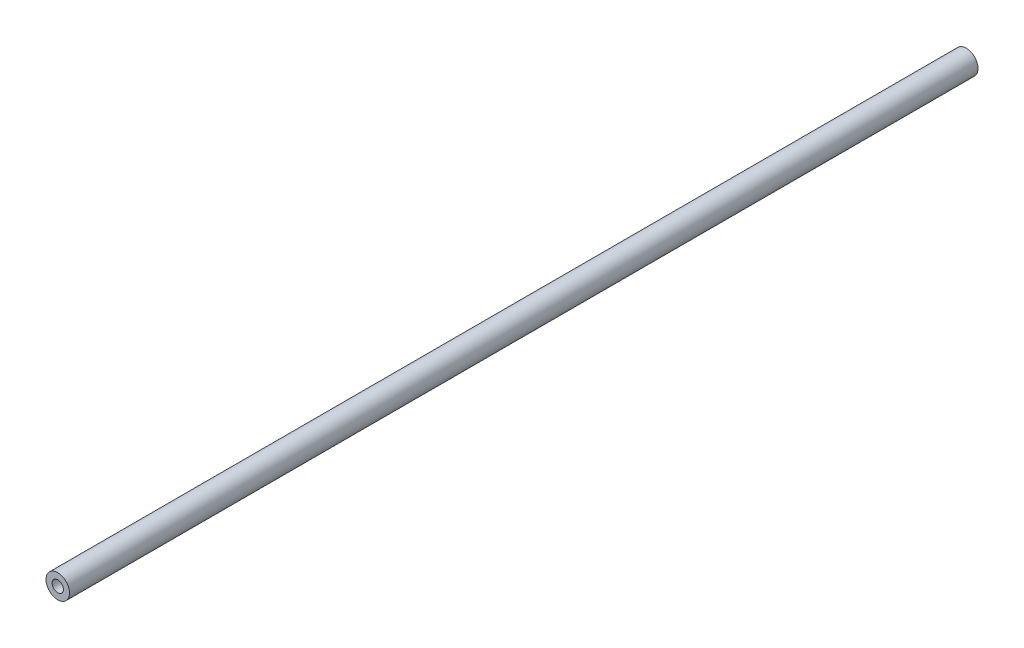
ISO-10303-21;
HEADER;
FILE_DESCRIPTION(('STEP AP214'),'2;1');
FILE_NAME('part.step','',(''),(''),'','','');
FILE_SCHEMA(('AUTOMOTIVE_DESIGN { 1 0 10303 214 1 1 1 1 }'));
ENDSEC;
DATA;
#1=APPLICATION_CONTEXT('core data for automotive mechanical design processes');
#2=APPLICATION_PROTOCOL_DEFINITION('international standard','automotive_design',2000,#1);
#3=PRODUCT_CONTEXT('',#1,'mechanical');
#4=PRODUCT('Part','Part','',(#3));
#5=PRODUCT_RELATED_PRODUCT_CATEGORY('part','',(#4));
#6=PRODUCT_DEFINITION_FORMATION('','',#4);
#7=PRODUCT_DEFINITION_CONTEXT('part definition',#1,'design');
#8=PRODUCT_DEFINITION('design','',#6,#7);
#9=PRODUCT_DEFINITION_SHAPE('','',#8);
#10=(LENGTH_UNIT() NAMED_UNIT(*) SI_UNIT(.MILLI.,.METRE.));
#11=(NAMED_UNIT(*) PLANE_ANGLE_UNIT() SI_UNIT($,.RADIAN.));
#12=(NAMED_UNIT(*) SI_UNIT($,.STERADIAN.) SOLID_ANGLE_UNIT());
#13=UNCERTAINTY_MEASURE_WITH_UNIT(LENGTH_MEASURE(1.E-05),#10,'distance_accuracy_value','');
#14=(GEOMETRIC_REPRESENTATION_CONTEXT(3) GLOBAL_UNCERTAINTY_ASSIGNED_CONTEXT((#13)) GLOBAL_UNIT_ASSIGNED_CONTEXT((#10,
#11,#12)) REPRESENTATION_CONTEXT('',''));
#15=CARTESIAN_POINT('',(0.,0.,0.));
#16=DIRECTION('',(0.,0.,1.));
#17=DIRECTION('',(1.,0.,0.));
#18=AXIS2_PLACEMENT_3D('',#15,#16,#17);
#19=CARTESIAN_POINT('',(1.54390389361936E-13,0.,24.511));
#20=DIRECTION('',(0.,0.,1.));
#21=DIRECTION('',(1.,0.,0.));
#22=AXIS2_PLACEMENT_3D('',#19,#20,#21);
#23=PLANE('',#22);
#24=CARTESIAN_POINT('',(1.54390389361936E-13,0.,24.511));
#25=DIRECTION('',(0.,0.,1.));
#26=DIRECTION('',(1.,0.,0.));
#27=AXIS2_PLACEMENT_3D('',#24,#25,#26);
#28=CIRCLE('',#27,0.3175);
#29=CARTESIAN_POINT('',(0.317500000000154,0.,24.511));
#30=VERTEX_POINT('',#29);
#31=EDGE_CURVE('E10',#30,#30,#28,.T.);
#32=ORIENTED_EDGE('',*,*,#31,.T.);
#33=EDGE_LOOP('',(#32));
#34=FACE_BOUND('',#33,.T.);
#35=CARTESIAN_POINT('',(1.54390389361936E-13,0.,24.511));
#36=DIRECTION('',(0.,0.,1.));
#37=DIRECTION('',(1.,0.,0.));
#38=AXIS2_PLACEMENT_3D('',#35,#36,#37);
#39=CIRCLE('',#38,0.1524);
#40=CARTESIAN_POINT('',(0.152400000000154,0.,24.511));
#41=VERTEX_POINT('',#40);
#42=EDGE_CURVE('E52',#41,#41,#39,.T.);
#43=ORIENTED_EDGE('',*,*,#42,.F.);
#44=EDGE_LOOP('',(#43));
#45=FACE_BOUND('',#44,.T.);
#46=ADVANCED_FACE('F38',(#34,#45),#23,.T.);
#47=CARTESIAN_POINT('',(0.,0.,0.));
#48=DIRECTION('',(0.,0.,1.));
#49=DIRECTION('',(1.,0.,0.));
#50=AXIS2_PLACEMENT_3D('',#47,#48,#49);
#51=PLANE('',#50);
#52=CARTESIAN_POINT('',(0.,0.,0.));
#53=DIRECTION('',(0.,0.,1.));
#54=DIRECTION('',(1.,0.,0.));
#55=AXIS2_PLACEMENT_3D('',#52,#53,#54);
#56=CIRCLE('',#55,0.3175);
#57=CARTESIAN_POINT('',(0.3175,0.,0.));
#58=VERTEX_POINT('',#57);
#59=EDGE_CURVE('E42',#58,#58,#56,.T.);
#60=ORIENTED_EDGE('',*,*,#59,.F.);
#61=EDGE_LOOP('',(#60));
#62=FACE_BOUND('',#61,.T.);
#63=CARTESIAN_POINT('',(0.,0.,0.));
#64=DIRECTION('',(0.,0.,1.));
#65=DIRECTION('',(1.,0.,0.));
#66=AXIS2_PLACEMENT_3D('',#63,#64,#65);
#67=CIRCLE('',#66,0.1524);
#68=CARTESIAN_POINT('',(0.1524,0.,0.));
#69=VERTEX_POINT('',#68);
#70=EDGE_CURVE('E54',#69,#69,#67,.T.);
#71=ORIENTED_EDGE('',*,*,#70,.T.);
#72=EDGE_LOOP('',(#71));
#73=FACE_BOUND('',#72,.T.);
#74=ADVANCED_FACE('F67',(#62,#73),#51,.F.);
#75=CARTESIAN_POINT('',(1.54390389361936E-13,0.,24.511));
#76=DIRECTION('',(0.,0.,-1.));
#77=DIRECTION('',(-1.,0.,0.));
#78=AXIS2_PLACEMENT_3D('',#75,#76,#77);
#79=CYLINDRICAL_SURFACE('',#78,0.3175);
#80=ORIENTED_EDGE('',*,*,#31,.F.);
#81=EDGE_LOOP('',(#80));
#82=FACE_BOUND('',#81,.T.);
#83=ORIENTED_EDGE('',*,*,#59,.T.);
#84=EDGE_LOOP('',(#83));
#85=FACE_BOUND('',#84,.T.);
#86=ADVANCED_FACE('F40',(#82,#85),#79,.T.);
#87=CARTESIAN_POINT('',(1.54390389361936E-13,0.,24.511));
#88=DIRECTION('',(0.,0.,-1.));
#89=DIRECTION('',(-1.,0.,0.));
#90=AXIS2_PLACEMENT_3D('',#87,#88,#89);
#91=CYLINDRICAL_SURFACE('',#90,0.1524);
#92=ORIENTED_EDGE('',*,*,#42,.T.);
#93=EDGE_LOOP('',(#92));
#94=FACE_BOUND('',#93,.T.);
#95=ORIENTED_EDGE('',*,*,#70,.F.);
#96=EDGE_LOOP('',(#95));
#97=FACE_BOUND('',#96,.T.);
#98=ADVANCED_FACE('F63',(#94,#97),#91,.F.);
#99=CLOSED_SHELL('',(#46,#74,#86,#98));
#100=MANIFOLD_SOLID_BREP('B2',#99);
#101=ADVANCED_BREP_SHAPE_REPRESENTATION('',(#18,#100),#14);
#102=SHAPE_DEFINITION_REPRESENTATION(#9,#101);
ENDSEC;
END-ISO-10303-21;
